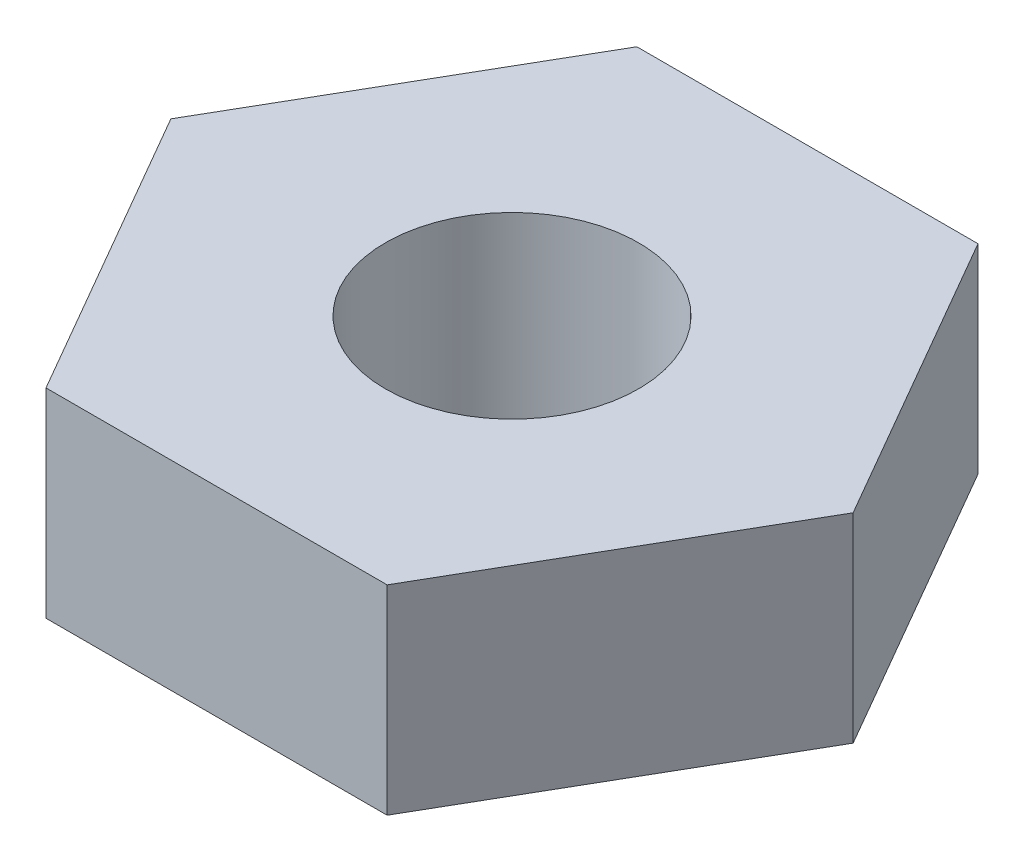
ISO-10303-21;
HEADER;
FILE_DESCRIPTION(('STEP AP214'),'2;1');
FILE_NAME('part.step','',(''),(''),'','','');
FILE_SCHEMA(('AUTOMOTIVE_DESIGN { 1 0 10303 214 1 1 1 1 }'));
ENDSEC;
DATA;
#1=APPLICATION_CONTEXT('core data for automotive mechanical design processes');
#2=APPLICATION_PROTOCOL_DEFINITION('international standard','automotive_design',2000,#1);
#3=PRODUCT_CONTEXT('',#1,'mechanical');
#4=PRODUCT('Part','Part','',(#3));
#5=PRODUCT_RELATED_PRODUCT_CATEGORY('part','',(#4));
#6=PRODUCT_DEFINITION_FORMATION('','',#4);
#7=PRODUCT_DEFINITION_CONTEXT('part definition',#1,'design');
#8=PRODUCT_DEFINITION('design','',#6,#7);
#9=PRODUCT_DEFINITION_SHAPE('','',#8);
#10=(LENGTH_UNIT() NAMED_UNIT(*) SI_UNIT(.MILLI.,.METRE.));
#11=(NAMED_UNIT(*) PLANE_ANGLE_UNIT() SI_UNIT($,.RADIAN.));
#12=(NAMED_UNIT(*) SI_UNIT($,.STERADIAN.) SOLID_ANGLE_UNIT());
#13=UNCERTAINTY_MEASURE_WITH_UNIT(LENGTH_MEASURE(1.E-05),#10,'distance_accuracy_value','');
#14=(GEOMETRIC_REPRESENTATION_CONTEXT(3) GLOBAL_UNCERTAINTY_ASSIGNED_CONTEXT((#13)) GLOBAL_UNIT_ASSIGNED_CONTEXT((#10,
#11,#12)) REPRESENTATION_CONTEXT('',''));
#15=CARTESIAN_POINT('',(0.,0.,0.));
#16=DIRECTION('',(0.,0.,1.));
#17=DIRECTION('',(1.,0.,0.));
#18=AXIS2_PLACEMENT_3D('',#15,#16,#17);
#19=CARTESIAN_POINT('',(0.,1.3,0.));
#20=DIRECTION('',(0.,1.,0.));
#21=DIRECTION('',(0.,0.,1.));
#22=AXIS2_PLACEMENT_3D('',#19,#20,#21);
#23=PLANE('',#22);
#24=DIRECTION('',(0.5,0.,-0.866025403784439));
#25=VECTOR('',#24,1.);
#26=CARTESIAN_POINT('',(2.22279853638006,1.3,3.85));
#27=LINE('',#26,#25);
#28=CARTESIAN_POINT('',(2.22279853638006,1.3,3.85));
#29=VERTEX_POINT('',#28);
#30=CARTESIAN_POINT('',(4.44559707276012,1.3,0.));
#31=VERTEX_POINT('',#30);
#32=EDGE_CURVE('E146',#29,#31,#27,.T.);
#33=ORIENTED_EDGE('',*,*,#32,.T.);
#34=DIRECTION('',(-0.5,0.,-0.866025403784438));
#35=VECTOR('',#34,1.);
#36=CARTESIAN_POINT('',(4.44559707276012,1.3,0.));
#37=LINE('',#36,#35);
#38=CARTESIAN_POINT('',(2.22279853638006,1.3,-3.85));
#39=VERTEX_POINT('',#38);
#40=EDGE_CURVE('E94',#31,#39,#37,.T.);
#41=ORIENTED_EDGE('',*,*,#40,.T.);
#42=DIRECTION('',(-1.,0.,0.));
#43=VECTOR('',#42,1.);
#44=CARTESIAN_POINT('',(2.22279853638006,1.3,-3.85));
#45=LINE('',#44,#43);
#46=CARTESIAN_POINT('',(-2.22279853638006,1.3,-3.85));
#47=VERTEX_POINT('',#46);
#48=EDGE_CURVE('E107',#39,#47,#45,.T.);
#49=ORIENTED_EDGE('',*,*,#48,.T.);
#50=DIRECTION('',(-0.5,0.,0.866025403784439));
#51=VECTOR('',#50,1.);
#52=CARTESIAN_POINT('',(-2.22279853638006,1.3,-3.85));
#53=LINE('',#52,#51);
#54=CARTESIAN_POINT('',(-4.44559707276012,1.3,0.));
#55=VERTEX_POINT('',#54);
#56=EDGE_CURVE('E101',#47,#55,#53,.T.);
#57=ORIENTED_EDGE('',*,*,#56,.T.);
#58=DIRECTION('',(0.5,0.,0.866025403784438));
#59=VECTOR('',#58,1.);
#60=CARTESIAN_POINT('',(-4.44559707276012,1.3,0.));
#61=LINE('',#60,#59);
#62=CARTESIAN_POINT('',(-2.22279853638006,1.3,3.85));
#63=VERTEX_POINT('',#62);
#64=EDGE_CURVE('E105',#55,#63,#61,.T.);
#65=ORIENTED_EDGE('',*,*,#64,.T.);
#66=DIRECTION('',(1.,0.,0.));
#67=VECTOR('',#66,1.);
#68=CARTESIAN_POINT('',(-2.22279853638006,1.3,3.85));
#69=LINE('',#68,#67);
#70=EDGE_CURVE('E57',#63,#29,#69,.T.);
#71=ORIENTED_EDGE('',*,*,#70,.T.);
#72=EDGE_LOOP('',(#33,#41,#49,#57,#65,#71));
#73=FACE_BOUND('',#72,.T.);
#74=CARTESIAN_POINT('',(0.,1.3,0.));
#75=DIRECTION('',(0.,1.,0.));
#76=DIRECTION('',(0.,0.,1.));
#77=AXIS2_PLACEMENT_3D('',#74,#75,#76);
#78=CIRCLE('',#77,1.65);
#79=CARTESIAN_POINT('',(0.,1.3,1.65));
#80=VERTEX_POINT('',#79);
#81=EDGE_CURVE('E134',#80,#80,#78,.T.);
#82=ORIENTED_EDGE('',*,*,#81,.F.);
#83=EDGE_LOOP('',(#82));
#84=FACE_BOUND('',#83,.T.);
#85=ADVANCED_FACE('F39',(#73,#84),#23,.T.);
#86=CARTESIAN_POINT('',(0.,-1.3,0.));
#87=DIRECTION('',(0.,1.,0.));
#88=DIRECTION('',(0.,0.,1.));
#89=AXIS2_PLACEMENT_3D('',#86,#87,#88);
#90=PLANE('',#89);
#91=DIRECTION('',(0.5,0.,-0.866025403784439));
#92=VECTOR('',#91,1.);
#93=CARTESIAN_POINT('',(2.22279853638006,-1.3,3.85));
#94=LINE('',#93,#92);
#95=CARTESIAN_POINT('',(2.22279853638006,-1.3,3.85));
#96=VERTEX_POINT('',#95);
#97=CARTESIAN_POINT('',(4.44559707276012,-1.3,0.));
#98=VERTEX_POINT('',#97);
#99=EDGE_CURVE('E129',#96,#98,#94,.T.);
#100=ORIENTED_EDGE('',*,*,#99,.F.);
#101=DIRECTION('',(1.,0.,0.));
#102=VECTOR('',#101,1.);
#103=CARTESIAN_POINT('',(-2.22279853638006,-1.3,3.85));
#104=LINE('',#103,#102);
#105=CARTESIAN_POINT('',(-2.22279853638006,-1.3,3.85));
#106=VERTEX_POINT('',#105);
#107=EDGE_CURVE('E86',#106,#96,#104,.T.);
#108=ORIENTED_EDGE('',*,*,#107,.F.);
#109=DIRECTION('',(0.5,0.,0.866025403784438));
#110=VECTOR('',#109,1.);
#111=CARTESIAN_POINT('',(-4.44559707276012,-1.3,0.));
#112=LINE('',#111,#110);
#113=CARTESIAN_POINT('',(-4.44559707276012,-1.3,0.));
#114=VERTEX_POINT('',#113);
#115=EDGE_CURVE('E80',#114,#106,#112,.T.);
#116=ORIENTED_EDGE('',*,*,#115,.F.);
#117=DIRECTION('',(-0.5,0.,0.866025403784439));
#118=VECTOR('',#117,1.);
#119=CARTESIAN_POINT('',(-2.22279853638006,-1.3,-3.85));
#120=LINE('',#119,#118);
#121=CARTESIAN_POINT('',(-2.22279853638006,-1.3,-3.85));
#122=VERTEX_POINT('',#121);
#123=EDGE_CURVE('E116',#122,#114,#120,.T.);
#124=ORIENTED_EDGE('',*,*,#123,.F.);
#125=DIRECTION('',(-1.,0.,0.));
#126=VECTOR('',#125,1.);
#127=CARTESIAN_POINT('',(2.22279853638006,-1.3,-3.85));
#128=LINE('',#127,#126);
#129=CARTESIAN_POINT('',(2.22279853638006,-1.3,-3.85));
#130=VERTEX_POINT('',#129);
#131=EDGE_CURVE('E137',#130,#122,#128,.T.);
#132=ORIENTED_EDGE('',*,*,#131,.F.);
#133=DIRECTION('',(-0.5,0.,-0.866025403784438));
#134=VECTOR('',#133,1.);
#135=CARTESIAN_POINT('',(4.44559707276012,-1.3,0.));
#136=LINE('',#135,#134);
#137=EDGE_CURVE('E133',#98,#130,#136,.T.);
#138=ORIENTED_EDGE('',*,*,#137,.F.);
#139=EDGE_LOOP('',(#100,#108,#116,#124,#132,#138));
#140=FACE_BOUND('',#139,.T.);
#141=CARTESIAN_POINT('',(0.,-1.3,0.));
#142=DIRECTION('',(0.,1.,0.));
#143=DIRECTION('',(0.,0.,1.));
#144=AXIS2_PLACEMENT_3D('',#141,#142,#143);
#145=CIRCLE('',#144,1.65);
#146=CARTESIAN_POINT('',(0.,-1.3,1.65));
#147=VERTEX_POINT('',#146);
#148=EDGE_CURVE('E243',#147,#147,#145,.T.);
#149=ORIENTED_EDGE('',*,*,#148,.T.);
#150=EDGE_LOOP('',(#149));
#151=FACE_BOUND('',#150,.T.);
#152=ADVANCED_FACE('F159',(#140,#151),#90,.F.);
#153=CARTESIAN_POINT('',(2.22279853638006,1.3,3.85));
#154=DIRECTION('',(-0.866025403784439,0.,-0.5));
#155=DIRECTION('',(-0.5,0.,0.866025403784439));
#156=AXIS2_PLACEMENT_3D('',#153,#154,#155);
#157=PLANE('',#156);
#158=ORIENTED_EDGE('',*,*,#99,.T.);
#159=DIRECTION('',(0.,-1.,0.));
#160=VECTOR('',#159,1.);
#161=CARTESIAN_POINT('',(4.44559707276012,1.3,0.));
#162=LINE('',#161,#160);
#163=EDGE_CURVE('E11',#31,#98,#162,.T.);
#164=ORIENTED_EDGE('',*,*,#163,.F.);
#165=ORIENTED_EDGE('',*,*,#32,.F.);
#166=DIRECTION('',(0.,-1.,0.));
#167=VECTOR('',#166,1.);
#168=CARTESIAN_POINT('',(2.22279853638006,1.3,3.85));
#169=LINE('',#168,#167);
#170=EDGE_CURVE('E125',#29,#96,#169,.T.);
#171=ORIENTED_EDGE('',*,*,#170,.T.);
#172=EDGE_LOOP('',(#158,#164,#165,#171));
#173=FACE_BOUND('',#172,.T.);
#174=ADVANCED_FACE('F41',(#173),#157,.F.);
#175=CARTESIAN_POINT('',(4.44559707276012,1.3,0.));
#176=DIRECTION('',(-0.866025403784438,0.,0.5));
#177=DIRECTION('',(0.5,0.,0.866025403784438));
#178=AXIS2_PLACEMENT_3D('',#175,#176,#177);
#179=PLANE('',#178);
#180=ORIENTED_EDGE('',*,*,#137,.T.);
#181=DIRECTION('',(0.,-1.,0.));
#182=VECTOR('',#181,1.);
#183=CARTESIAN_POINT('',(2.22279853638006,1.3,-3.85));
#184=LINE('',#183,#182);
#185=EDGE_CURVE('E49',#39,#130,#184,.T.);
#186=ORIENTED_EDGE('',*,*,#185,.F.);
#187=ORIENTED_EDGE('',*,*,#40,.F.);
#188=ORIENTED_EDGE('',*,*,#163,.T.);
#189=EDGE_LOOP('',(#180,#186,#187,#188));
#190=FACE_BOUND('',#189,.T.);
#191=ADVANCED_FACE('F184',(#190),#179,.F.);
#192=CARTESIAN_POINT('',(2.22279853638006,1.3,-3.85));
#193=DIRECTION('',(0.,0.,1.));
#194=DIRECTION('',(1.,0.,0.));
#195=AXIS2_PLACEMENT_3D('',#192,#193,#194);
#196=PLANE('',#195);
#197=ORIENTED_EDGE('',*,*,#131,.T.);
#198=DIRECTION('',(0.,-1.,0.));
#199=VECTOR('',#198,1.);
#200=CARTESIAN_POINT('',(-2.22279853638006,1.3,-3.85));
#201=LINE('',#200,#199);
#202=EDGE_CURVE('E118',#47,#122,#201,.T.);
#203=ORIENTED_EDGE('',*,*,#202,.F.);
#204=ORIENTED_EDGE('',*,*,#48,.F.);
#205=ORIENTED_EDGE('',*,*,#185,.T.);
#206=EDGE_LOOP('',(#197,#203,#204,#205));
#207=FACE_BOUND('',#206,.T.);
#208=ADVANCED_FACE('F156',(#207),#196,.F.);
#209=CARTESIAN_POINT('',(-2.22279853638006,1.3,-3.85));
#210=DIRECTION('',(0.866025403784439,0.,0.5));
#211=DIRECTION('',(0.5,0.,-0.866025403784439));
#212=AXIS2_PLACEMENT_3D('',#209,#210,#211);
#213=PLANE('',#212);
#214=ORIENTED_EDGE('',*,*,#123,.T.);
#215=DIRECTION('',(0.,-1.,0.));
#216=VECTOR('',#215,1.);
#217=CARTESIAN_POINT('',(-4.44559707276012,1.3,0.));
#218=LINE('',#217,#216);
#219=EDGE_CURVE('E113',#55,#114,#218,.T.);
#220=ORIENTED_EDGE('',*,*,#219,.F.);
#221=ORIENTED_EDGE('',*,*,#56,.F.);
#222=ORIENTED_EDGE('',*,*,#202,.T.);
#223=EDGE_LOOP('',(#214,#220,#221,#222));
#224=FACE_BOUND('',#223,.T.);
#225=ADVANCED_FACE('F114',(#224),#213,.F.);
#226=CARTESIAN_POINT('',(-4.44559707276012,1.3,0.));
#227=DIRECTION('',(0.866025403784439,0.,-0.5));
#228=DIRECTION('',(-0.5,0.,-0.866025403784439));
#229=AXIS2_PLACEMENT_3D('',#226,#227,#228);
#230=PLANE('',#229);
#231=ORIENTED_EDGE('',*,*,#115,.T.);
#232=DIRECTION('',(0.,-1.,0.));
#233=VECTOR('',#232,1.);
#234=CARTESIAN_POINT('',(-2.22279853638006,1.3,3.85));
#235=LINE('',#234,#233);
#236=EDGE_CURVE('E119',#63,#106,#235,.T.);
#237=ORIENTED_EDGE('',*,*,#236,.F.);
#238=ORIENTED_EDGE('',*,*,#64,.F.);
#239=ORIENTED_EDGE('',*,*,#219,.T.);
#240=EDGE_LOOP('',(#231,#237,#238,#239));
#241=FACE_BOUND('',#240,.T.);
#242=ADVANCED_FACE('F121',(#241),#230,.F.);
#243=CARTESIAN_POINT('',(-2.22279853638006,1.3,3.85));
#244=DIRECTION('',(0.,0.,-1.));
#245=DIRECTION('',(-1.,0.,0.));
#246=AXIS2_PLACEMENT_3D('',#243,#244,#245);
#247=PLANE('',#246);
#248=ORIENTED_EDGE('',*,*,#107,.T.);
#249=ORIENTED_EDGE('',*,*,#170,.F.);
#250=ORIENTED_EDGE('',*,*,#70,.F.);
#251=ORIENTED_EDGE('',*,*,#236,.T.);
#252=EDGE_LOOP('',(#248,#249,#250,#251));
#253=FACE_BOUND('',#252,.T.);
#254=ADVANCED_FACE('F164',(#253),#247,.F.);
#255=CARTESIAN_POINT('',(0.,1.3,0.));
#256=DIRECTION('',(0.,-1.,0.));
#257=DIRECTION('',(0.,0.,-1.));
#258=AXIS2_PLACEMENT_3D('',#255,#256,#257);
#259=CYLINDRICAL_SURFACE('',#258,1.65);
#260=ORIENTED_EDGE('',*,*,#81,.T.);
#261=EDGE_LOOP('',(#260));
#262=FACE_BOUND('',#261,.T.);
#263=ORIENTED_EDGE('',*,*,#148,.F.);
#264=EDGE_LOOP('',(#263));
#265=FACE_BOUND('',#264,.T.);
#266=ADVANCED_FACE('F166',(#262,#265),#259,.F.);
#267=CLOSED_SHELL('',(#85,#152,#174,#191,#208,#225,#242,#254,#266));
#268=MANIFOLD_SOLID_BREP('B2',#267);
#269=ADVANCED_BREP_SHAPE_REPRESENTATION('',(#18,#268),#14);
#270=SHAPE_DEFINITION_REPRESENTATION(#9,#269);
ENDSEC;
END-ISO-10303-21;
